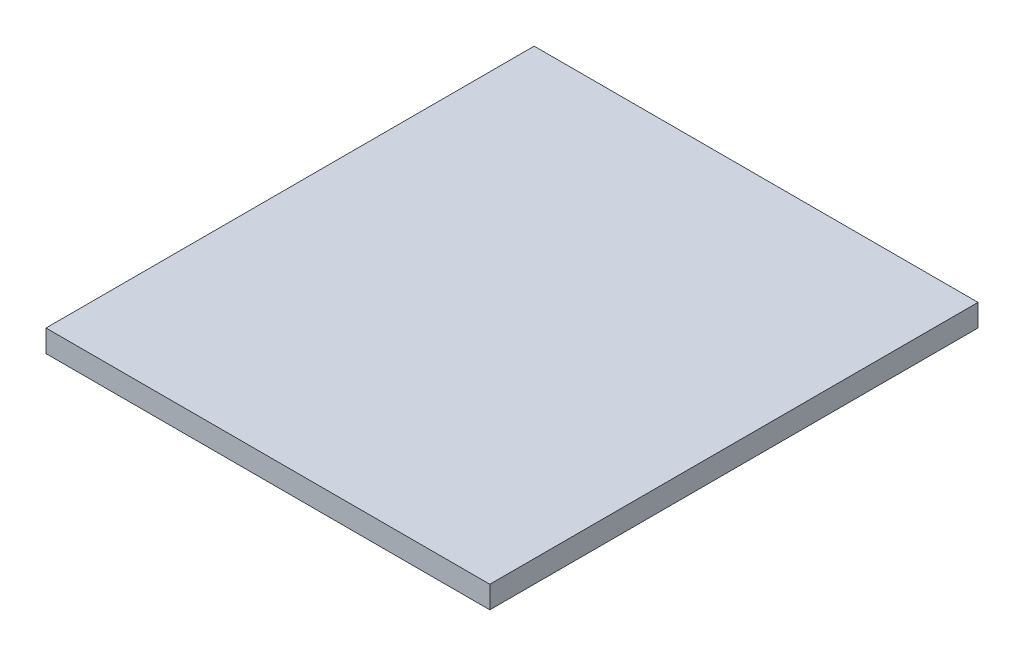
ISO-10303-21;
HEADER;
FILE_DESCRIPTION(('STEP AP214'),'2;1');
FILE_NAME('part.step','',(''),(''),'','','');
FILE_SCHEMA(('AUTOMOTIVE_DESIGN { 1 0 10303 214 1 1 1 1 }'));
ENDSEC;
DATA;
#1=APPLICATION_CONTEXT('core data for automotive mechanical design processes');
#2=APPLICATION_PROTOCOL_DEFINITION('international standard','automotive_design',2000,#1);
#3=PRODUCT_CONTEXT('',#1,'mechanical');
#4=PRODUCT('Part','Part','',(#3));
#5=PRODUCT_RELATED_PRODUCT_CATEGORY('part','',(#4));
#6=PRODUCT_DEFINITION_FORMATION('','',#4);
#7=PRODUCT_DEFINITION_CONTEXT('part definition',#1,'design');
#8=PRODUCT_DEFINITION('design','',#6,#7);
#9=PRODUCT_DEFINITION_SHAPE('','',#8);
#10=(LENGTH_UNIT() NAMED_UNIT(*) SI_UNIT(.MILLI.,.METRE.));
#11=(NAMED_UNIT(*) PLANE_ANGLE_UNIT() SI_UNIT($,.RADIAN.));
#12=(NAMED_UNIT(*) SI_UNIT($,.STERADIAN.) SOLID_ANGLE_UNIT());
#13=UNCERTAINTY_MEASURE_WITH_UNIT(LENGTH_MEASURE(1.E-05),#10,'distance_accuracy_value','');
#14=(GEOMETRIC_REPRESENTATION_CONTEXT(3) GLOBAL_UNCERTAINTY_ASSIGNED_CONTEXT((#13)) GLOBAL_UNIT_ASSIGNED_CONTEXT((#10,
#11,#12)) REPRESENTATION_CONTEXT('',''));
#15=CARTESIAN_POINT('',(0.,0.,0.));
#16=DIRECTION('',(0.,0.,1.));
#17=DIRECTION('',(1.,0.,0.));
#18=AXIS2_PLACEMENT_3D('',#15,#16,#17);
#19=CARTESIAN_POINT('',(-1.,0.1,1.1));
#20=DIRECTION('',(0.,0.,-1.));
#21=DIRECTION('',(-1.,0.,0.));
#22=AXIS2_PLACEMENT_3D('',#19,#20,#21);
#23=PLANE('',#22);
#24=DIRECTION('',(1.,0.,0.));
#25=VECTOR('',#24,1.);
#26=CARTESIAN_POINT('',(-1.,0.,1.1));
#27=LINE('',#26,#25);
#28=CARTESIAN_POINT('',(-1.,0.,1.1));
#29=VERTEX_POINT('',#28);
#30=CARTESIAN_POINT('',(1.,0.,1.1));
#31=VERTEX_POINT('',#30);
#32=EDGE_CURVE('E102',#29,#31,#27,.T.);
#33=ORIENTED_EDGE('',*,*,#32,.T.);
#34=DIRECTION('',(0.,-1.,0.));
#35=VECTOR('',#34,1.);
#36=CARTESIAN_POINT('',(1.,0.1,1.1));
#37=LINE('',#36,#35);
#38=CARTESIAN_POINT('',(1.,0.1,1.1));
#39=VERTEX_POINT('',#38);
#40=EDGE_CURVE('E11',#39,#31,#37,.T.);
#41=ORIENTED_EDGE('',*,*,#40,.F.);
#42=DIRECTION('',(1.,0.,0.));
#43=VECTOR('',#42,1.);
#44=CARTESIAN_POINT('',(-1.,0.1,1.1));
#45=LINE('',#44,#43);
#46=CARTESIAN_POINT('',(-1.,0.1,1.1));
#47=VERTEX_POINT('',#46);
#48=EDGE_CURVE('E90',#47,#39,#45,.T.);
#49=ORIENTED_EDGE('',*,*,#48,.F.);
#50=DIRECTION('',(0.,-1.,0.));
#51=VECTOR('',#50,1.);
#52=CARTESIAN_POINT('',(-1.,0.1,1.1));
#53=LINE('',#52,#51);
#54=EDGE_CURVE('E98',#47,#29,#53,.T.);
#55=ORIENTED_EDGE('',*,*,#54,.T.);
#56=EDGE_LOOP('',(#33,#41,#49,#55));
#57=FACE_BOUND('',#56,.T.);
#58=ADVANCED_FACE('F39',(#57),#23,.F.);
#59=CARTESIAN_POINT('',(1.,0.1,1.1));
#60=DIRECTION('',(-1.,0.,0.));
#61=DIRECTION('',(0.,0.,1.));
#62=AXIS2_PLACEMENT_3D('',#59,#60,#61);
#63=PLANE('',#62);
#64=DIRECTION('',(0.,0.,-1.));
#65=VECTOR('',#64,1.);
#66=CARTESIAN_POINT('',(1.,0.,1.1));
#67=LINE('',#66,#65);
#68=CARTESIAN_POINT('',(1.,0.,-1.1));
#69=VERTEX_POINT('',#68);
#70=EDGE_CURVE('E94',#31,#69,#67,.T.);
#71=ORIENTED_EDGE('',*,*,#70,.T.);
#72=DIRECTION('',(0.,-1.,0.));
#73=VECTOR('',#72,1.);
#74=CARTESIAN_POINT('',(1.,0.1,-1.1));
#75=LINE('',#74,#73);
#76=CARTESIAN_POINT('',(1.,0.1,-1.1));
#77=VERTEX_POINT('',#76);
#78=EDGE_CURVE('E47',#77,#69,#75,.T.);
#79=ORIENTED_EDGE('',*,*,#78,.F.);
#80=DIRECTION('',(0.,0.,-1.));
#81=VECTOR('',#80,1.);
#82=CARTESIAN_POINT('',(1.,0.1,1.1));
#83=LINE('',#82,#81);
#84=EDGE_CURVE('E85',#39,#77,#83,.T.);
#85=ORIENTED_EDGE('',*,*,#84,.F.);
#86=ORIENTED_EDGE('',*,*,#40,.T.);
#87=EDGE_LOOP('',(#71,#79,#85,#86));
#88=FACE_BOUND('',#87,.T.);
#89=ADVANCED_FACE('F93',(#88),#63,.F.);
#90=CARTESIAN_POINT('',(1.,0.1,-1.1));
#91=DIRECTION('',(0.,0.,1.));
#92=DIRECTION('',(1.,0.,0.));
#93=AXIS2_PLACEMENT_3D('',#90,#91,#92);
#94=PLANE('',#93);
#95=DIRECTION('',(-1.,0.,0.));
#96=VECTOR('',#95,1.);
#97=CARTESIAN_POINT('',(1.,0.,-1.1));
#98=LINE('',#97,#96);
#99=CARTESIAN_POINT('',(-1.,0.,-1.1));
#100=VERTEX_POINT('',#99);
#101=EDGE_CURVE('E72',#69,#100,#98,.T.);
#102=ORIENTED_EDGE('',*,*,#101,.T.);
#103=DIRECTION('',(0.,-1.,0.));
#104=VECTOR('',#103,1.);
#105=CARTESIAN_POINT('',(-1.,0.1,-1.1));
#106=LINE('',#105,#104);
#107=CARTESIAN_POINT('',(-1.,0.1,-1.1));
#108=VERTEX_POINT('',#107);
#109=EDGE_CURVE('E95',#108,#100,#106,.T.);
#110=ORIENTED_EDGE('',*,*,#109,.F.);
#111=DIRECTION('',(-1.,0.,0.));
#112=VECTOR('',#111,1.);
#113=CARTESIAN_POINT('',(1.,0.1,-1.1));
#114=LINE('',#113,#112);
#115=EDGE_CURVE('E88',#77,#108,#114,.T.);
#116=ORIENTED_EDGE('',*,*,#115,.F.);
#117=ORIENTED_EDGE('',*,*,#78,.T.);
#118=EDGE_LOOP('',(#102,#110,#116,#117));
#119=FACE_BOUND('',#118,.T.);
#120=ADVANCED_FACE('F96',(#119),#94,.F.);
#121=CARTESIAN_POINT('',(-1.,0.1,-1.1));
#122=DIRECTION('',(1.,0.,0.));
#123=DIRECTION('',(0.,0.,-1.));
#124=AXIS2_PLACEMENT_3D('',#121,#122,#123);
#125=PLANE('',#124);
#126=DIRECTION('',(0.,0.,1.));
#127=VECTOR('',#126,1.);
#128=CARTESIAN_POINT('',(-1.,0.,-1.1));
#129=LINE('',#128,#127);
#130=EDGE_CURVE('E78',#100,#29,#129,.T.);
#131=ORIENTED_EDGE('',*,*,#130,.T.);
#132=ORIENTED_EDGE('',*,*,#54,.F.);
#133=DIRECTION('',(0.,0.,1.));
#134=VECTOR('',#133,1.);
#135=CARTESIAN_POINT('',(-1.,0.1,-1.1));
#136=LINE('',#135,#134);
#137=EDGE_CURVE('E55',#108,#47,#136,.T.);
#138=ORIENTED_EDGE('',*,*,#137,.F.);
#139=ORIENTED_EDGE('',*,*,#109,.T.);
#140=EDGE_LOOP('',(#131,#132,#138,#139));
#141=FACE_BOUND('',#140,.T.);
#142=ADVANCED_FACE('F109',(#141),#125,.F.);
#143=CARTESIAN_POINT('',(0.,0.1,0.));
#144=DIRECTION('',(0.,1.,0.));
#145=DIRECTION('',(0.,0.,1.));
#146=AXIS2_PLACEMENT_3D('',#143,#144,#145);
#147=PLANE('',#146);
#148=ORIENTED_EDGE('',*,*,#48,.T.);
#149=ORIENTED_EDGE('',*,*,#84,.T.);
#150=ORIENTED_EDGE('',*,*,#115,.T.);
#151=ORIENTED_EDGE('',*,*,#137,.T.);
#152=EDGE_LOOP('',(#148,#149,#150,#151));
#153=FACE_BOUND('',#152,.T.);
#154=ADVANCED_FACE('F86',(#153),#147,.T.);
#155=CARTESIAN_POINT('',(0.,0.,0.));
#156=DIRECTION('',(0.,1.,0.));
#157=DIRECTION('',(0.,0.,1.));
#158=AXIS2_PLACEMENT_3D('',#155,#156,#157);
#159=PLANE('',#158);
#160=ORIENTED_EDGE('',*,*,#32,.F.);
#161=ORIENTED_EDGE('',*,*,#130,.F.);
#162=ORIENTED_EDGE('',*,*,#101,.F.);
#163=ORIENTED_EDGE('',*,*,#70,.F.);
#164=EDGE_LOOP('',(#160,#161,#162,#163));
#165=FACE_BOUND('',#164,.T.);
#166=ADVANCED_FACE('F112',(#165),#159,.F.);
#167=CLOSED_SHELL('',(#58,#89,#120,#142,#154,#166));
#168=MANIFOLD_SOLID_BREP('B2',#167);
#169=ADVANCED_BREP_SHAPE_REPRESENTATION('',(#18,#168),#14);
#170=SHAPE_DEFINITION_REPRESENTATION(#9,#169);
ENDSEC;
END-ISO-10303-21;
